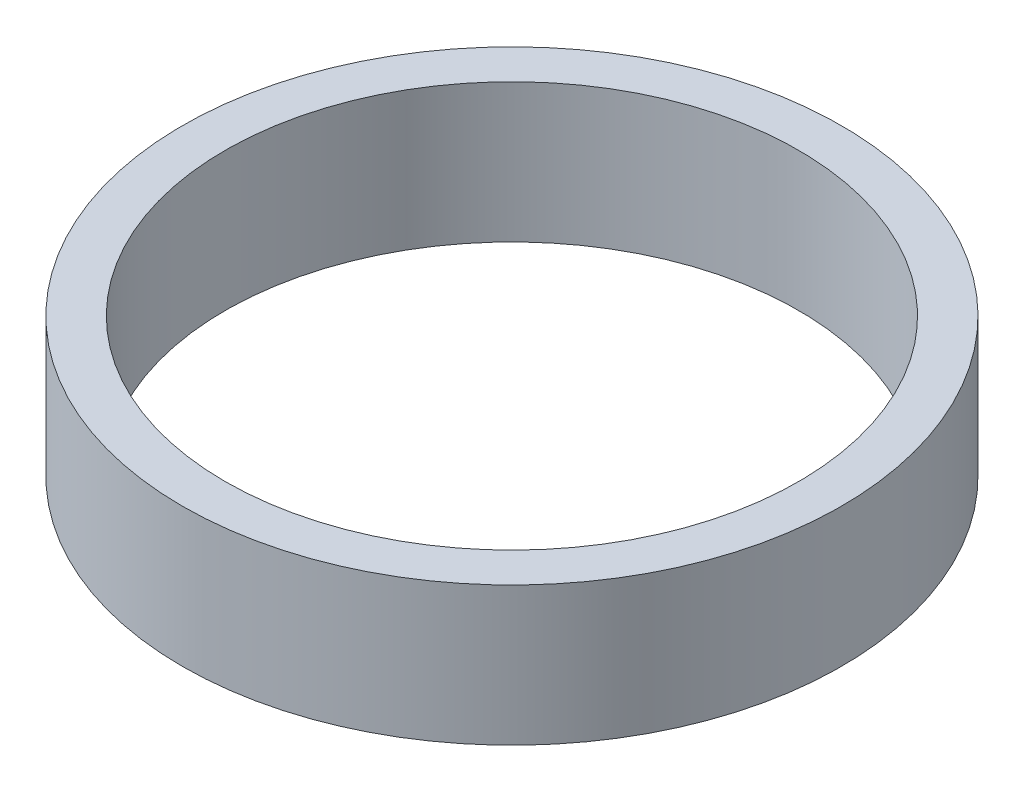
ISO-10303-21;
HEADER;
FILE_DESCRIPTION(('STEP AP214'),'2;1');
FILE_NAME('part.step','',(''),(''),'','','');
FILE_SCHEMA(('AUTOMOTIVE_DESIGN { 1 0 10303 214 1 1 1 1 }'));
ENDSEC;
DATA;
#1=APPLICATION_CONTEXT('core data for automotive mechanical design processes');
#2=APPLICATION_PROTOCOL_DEFINITION('international standard','automotive_design',2000,#1);
#3=PRODUCT_CONTEXT('',#1,'mechanical');
#4=PRODUCT('Part','Part','',(#3));
#5=PRODUCT_RELATED_PRODUCT_CATEGORY('part','',(#4));
#6=PRODUCT_DEFINITION_FORMATION('','',#4);
#7=PRODUCT_DEFINITION_CONTEXT('part definition',#1,'design');
#8=PRODUCT_DEFINITION('design','',#6,#7);
#9=PRODUCT_DEFINITION_SHAPE('','',#8);
#10=(LENGTH_UNIT() NAMED_UNIT(*) SI_UNIT(.MILLI.,.METRE.));
#11=(NAMED_UNIT(*) PLANE_ANGLE_UNIT() SI_UNIT($,.RADIAN.));
#12=(NAMED_UNIT(*) SI_UNIT($,.STERADIAN.) SOLID_ANGLE_UNIT());
#13=UNCERTAINTY_MEASURE_WITH_UNIT(LENGTH_MEASURE(1.E-05),#10,'distance_accuracy_value','');
#14=(GEOMETRIC_REPRESENTATION_CONTEXT(3) GLOBAL_UNCERTAINTY_ASSIGNED_CONTEXT((#13)) GLOBAL_UNIT_ASSIGNED_CONTEXT((#10,
#11,#12)) REPRESENTATION_CONTEXT('',''));
#15=CARTESIAN_POINT('',(0.,0.,0.));
#16=DIRECTION('',(0.,0.,1.));
#17=DIRECTION('',(1.,0.,0.));
#18=AXIS2_PLACEMENT_3D('',#15,#16,#17);
#19=CARTESIAN_POINT('',(0.,12.7,0.));
#20=DIRECTION('',(0.,1.,0.));
#21=DIRECTION('',(0.,0.,1.));
#22=AXIS2_PLACEMENT_3D('',#19,#20,#21);
#23=PLANE('',#22);
#24=CARTESIAN_POINT('',(0.,12.7,0.));
#25=DIRECTION('',(0.,1.,0.));
#26=DIRECTION('',(0.,0.,1.));
#27=AXIS2_PLACEMENT_3D('',#24,#25,#26);
#28=CIRCLE('',#27,30.1625);
#29=CARTESIAN_POINT('',(0.,12.7,30.1625));
#30=VERTEX_POINT('',#29);
#31=EDGE_CURVE('E10',#30,#30,#28,.T.);
#32=ORIENTED_EDGE('',*,*,#31,.T.);
#33=EDGE_LOOP('',(#32));
#34=FACE_BOUND('',#33,.T.);
#35=CARTESIAN_POINT('',(0.,12.7,0.));
#36=DIRECTION('',(0.,1.,0.));
#37=DIRECTION('',(0.,0.,1.));
#38=AXIS2_PLACEMENT_3D('',#35,#36,#37);
#39=CIRCLE('',#38,26.2509);
#40=CARTESIAN_POINT('',(0.,12.7,26.2509));
#41=VERTEX_POINT('',#40);
#42=EDGE_CURVE('E43',#41,#41,#39,.T.);
#43=ORIENTED_EDGE('',*,*,#42,.F.);
#44=EDGE_LOOP('',(#43));
#45=FACE_BOUND('',#44,.T.);
#46=ADVANCED_FACE('F32',(#34,#45),#23,.T.);
#47=CARTESIAN_POINT('',(0.,0.,0.));
#48=DIRECTION('',(0.,1.,0.));
#49=DIRECTION('',(0.,0.,1.));
#50=AXIS2_PLACEMENT_3D('',#47,#48,#49);
#51=PLANE('',#50);
#52=CARTESIAN_POINT('',(0.,0.,0.));
#53=DIRECTION('',(0.,1.,0.));
#54=DIRECTION('',(0.,0.,1.));
#55=AXIS2_PLACEMENT_3D('',#52,#53,#54);
#56=CIRCLE('',#55,30.1625);
#57=CARTESIAN_POINT('',(0.,0.,30.1625));
#58=VERTEX_POINT('',#57);
#59=EDGE_CURVE('E36',#58,#58,#56,.T.);
#60=ORIENTED_EDGE('',*,*,#59,.F.);
#61=EDGE_LOOP('',(#60));
#62=FACE_BOUND('',#61,.T.);
#63=CARTESIAN_POINT('',(0.,0.,0.));
#64=DIRECTION('',(0.,1.,0.));
#65=DIRECTION('',(0.,0.,1.));
#66=AXIS2_PLACEMENT_3D('',#63,#64,#65);
#67=CIRCLE('',#66,26.2509);
#68=CARTESIAN_POINT('',(0.,0.,26.2509));
#69=VERTEX_POINT('',#68);
#70=EDGE_CURVE('E45',#69,#69,#67,.T.);
#71=ORIENTED_EDGE('',*,*,#70,.T.);
#72=EDGE_LOOP('',(#71));
#73=FACE_BOUND('',#72,.T.);
#74=ADVANCED_FACE('F55',(#62,#73),#51,.F.);
#75=CARTESIAN_POINT('',(0.,12.7,0.));
#76=DIRECTION('',(0.,-1.,0.));
#77=DIRECTION('',(0.,0.,-1.));
#78=AXIS2_PLACEMENT_3D('',#75,#76,#77);
#79=CYLINDRICAL_SURFACE('',#78,30.1625);
#80=ORIENTED_EDGE('',*,*,#31,.F.);
#81=EDGE_LOOP('',(#80));
#82=FACE_BOUND('',#81,.T.);
#83=ORIENTED_EDGE('',*,*,#59,.T.);
#84=EDGE_LOOP('',(#83));
#85=FACE_BOUND('',#84,.T.);
#86=ADVANCED_FACE('F34',(#82,#85),#79,.T.);
#87=CARTESIAN_POINT('',(0.,12.7,0.));
#88=DIRECTION('',(0.,-1.,0.));
#89=DIRECTION('',(0.,0.,-1.));
#90=AXIS2_PLACEMENT_3D('',#87,#88,#89);
#91=CYLINDRICAL_SURFACE('',#90,26.2509);
#92=ORIENTED_EDGE('',*,*,#42,.T.);
#93=EDGE_LOOP('',(#92));
#94=FACE_BOUND('',#93,.T.);
#95=ORIENTED_EDGE('',*,*,#70,.F.);
#96=EDGE_LOOP('',(#95));
#97=FACE_BOUND('',#96,.T.);
#98=ADVANCED_FACE('F51',(#94,#97),#91,.F.);
#99=CLOSED_SHELL('',(#46,#74,#86,#98));
#100=MANIFOLD_SOLID_BREP('B2',#99);
#101=ADVANCED_BREP_SHAPE_REPRESENTATION('',(#18,#100),#14);
#102=SHAPE_DEFINITION_REPRESENTATION(#9,#101);
ENDSEC;
END-ISO-10303-21;
